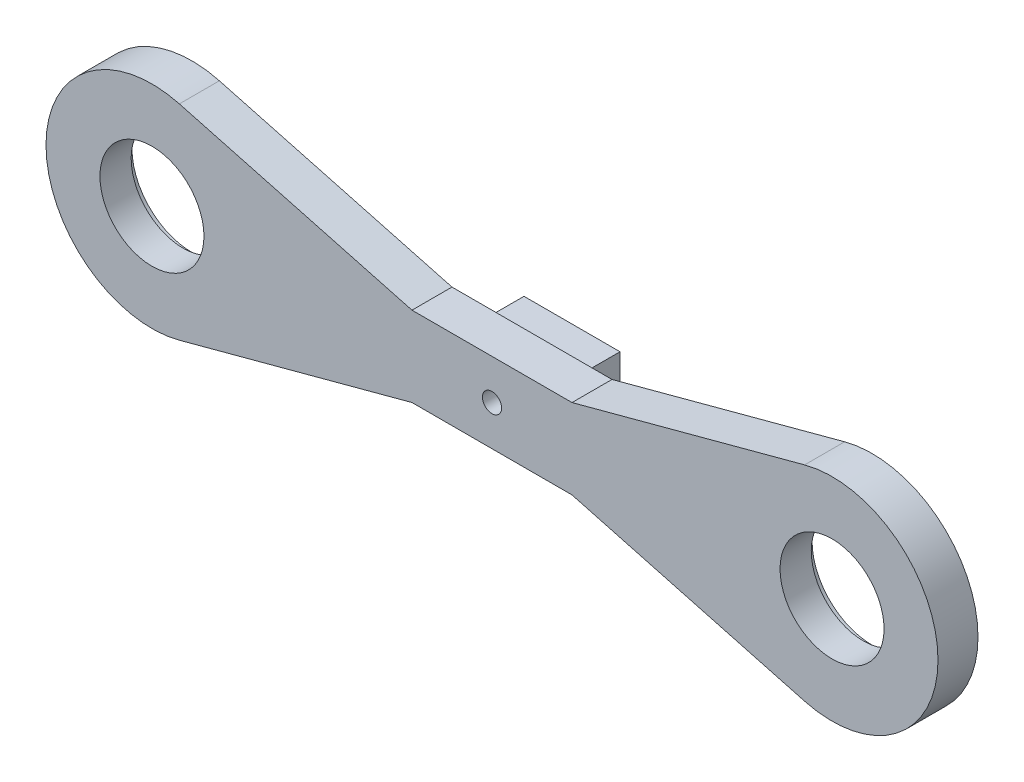
ISO-10303-21;
HEADER;
FILE_DESCRIPTION(('STEP AP214'),'2;1');
FILE_NAME('part.step','',(''),(''),'','','');
FILE_SCHEMA(('AUTOMOTIVE_DESIGN { 1 0 10303 214 1 1 1 1 }'));
ENDSEC;
DATA;
#1=APPLICATION_CONTEXT('core data for automotive mechanical design processes');
#2=APPLICATION_PROTOCOL_DEFINITION('international standard','automotive_design',2000,#1);
#3=PRODUCT_CONTEXT('',#1,'mechanical');
#4=PRODUCT('Part','Part','',(#3));
#5=PRODUCT_RELATED_PRODUCT_CATEGORY('part','',(#4));
#6=PRODUCT_DEFINITION_FORMATION('','',#4);
#7=PRODUCT_DEFINITION_CONTEXT('part definition',#1,'design');
#8=PRODUCT_DEFINITION('design','',#6,#7);
#9=PRODUCT_DEFINITION_SHAPE('','',#8);
#10=(LENGTH_UNIT() NAMED_UNIT(*) SI_UNIT(.MILLI.,.METRE.));
#11=(NAMED_UNIT(*) PLANE_ANGLE_UNIT() SI_UNIT($,.RADIAN.));
#12=(NAMED_UNIT(*) SI_UNIT($,.STERADIAN.) SOLID_ANGLE_UNIT());
#13=UNCERTAINTY_MEASURE_WITH_UNIT(LENGTH_MEASURE(1.E-05),#10,'distance_accuracy_value','');
#14=(GEOMETRIC_REPRESENTATION_CONTEXT(3) GLOBAL_UNCERTAINTY_ASSIGNED_CONTEXT((#13)) GLOBAL_UNIT_ASSIGNED_CONTEXT((#10,
#11,#12)) REPRESENTATION_CONTEXT('',''));
#15=CARTESIAN_POINT('',(0.,0.,0.));
#16=DIRECTION('',(0.,0.,1.));
#17=DIRECTION('',(1.,0.,0.));
#18=AXIS2_PLACEMENT_3D('',#15,#16,#17);
#19=CARTESIAN_POINT('',(-42.5000000000004,0.,5.));
#20=DIRECTION('',(0.,0.,-1.));
#21=DIRECTION('',(-1.,0.,0.));
#22=AXIS2_PLACEMENT_3D('',#19,#20,#21);
#23=CYLINDRICAL_SURFACE('',#22,6.5);
#24=CARTESIAN_POINT('',(-42.5000000000004,0.,5.));
#25=DIRECTION('',(0.,0.,1.));
#26=DIRECTION('',(1.,0.,0.));
#27=AXIS2_PLACEMENT_3D('',#24,#25,#26);
#28=CIRCLE('',#27,6.5);
#29=CARTESIAN_POINT('',(-36.0000000000004,0.,5.));
#30=VERTEX_POINT('',#29);
#31=EDGE_CURVE('E280',#30,#30,#28,.T.);
#32=ORIENTED_EDGE('',*,*,#31,.T.);
#33=EDGE_LOOP('',(#32));
#34=FACE_BOUND('',#33,.T.);
#35=CARTESIAN_POINT('',(-42.5000000000004,0.,1.1));
#36=DIRECTION('',(0.,0.,-1.));
#37=DIRECTION('',(-1.,0.,0.));
#38=AXIS2_PLACEMENT_3D('',#35,#36,#37);
#39=CIRCLE('',#38,6.5);
#40=CARTESIAN_POINT('',(-49.0000000000004,0.,1.1));
#41=VERTEX_POINT('',#40);
#42=EDGE_CURVE('E67',#41,#41,#39,.T.);
#43=ORIENTED_EDGE('',*,*,#42,.T.);
#44=EDGE_LOOP('',(#43));
#45=FACE_BOUND('',#44,.T.);
#46=ADVANCED_FACE('F63',(#34,#45),#23,.F.);
#47=CARTESIAN_POINT('',(42.4999999999997,0.,5.));
#48=DIRECTION('',(0.,0.,-1.));
#49=DIRECTION('',(-1.,0.,0.));
#50=AXIS2_PLACEMENT_3D('',#47,#48,#49);
#51=CYLINDRICAL_SURFACE('',#50,6.5);
#52=CARTESIAN_POINT('',(42.4999999999997,0.,5.));
#53=DIRECTION('',(0.,0.,1.));
#54=DIRECTION('',(1.,0.,0.));
#55=AXIS2_PLACEMENT_3D('',#52,#53,#54);
#56=CIRCLE('',#55,6.5);
#57=CARTESIAN_POINT('',(48.9999999999996,0.,5.));
#58=VERTEX_POINT('',#57);
#59=EDGE_CURVE('E266',#58,#58,#56,.T.);
#60=ORIENTED_EDGE('',*,*,#59,.T.);
#61=EDGE_LOOP('',(#60));
#62=FACE_BOUND('',#61,.T.);
#63=CARTESIAN_POINT('',(42.4999999999997,0.,1.1));
#64=DIRECTION('',(0.,0.,-1.));
#65=DIRECTION('',(-1.,0.,0.));
#66=AXIS2_PLACEMENT_3D('',#63,#64,#65);
#67=CIRCLE('',#66,6.5);
#68=CARTESIAN_POINT('',(35.9999999999997,0.,1.1));
#69=VERTEX_POINT('',#68);
#70=EDGE_CURVE('E360',#69,#69,#67,.T.);
#71=ORIENTED_EDGE('',*,*,#70,.T.);
#72=EDGE_LOOP('',(#71));
#73=FACE_BOUND('',#72,.T.);
#74=ADVANCED_FACE('F416',(#62,#73),#51,.F.);
#75=CARTESIAN_POINT('',(-42.5000000000004,0.,5.));
#76=DIRECTION('',(0.,0.,1.));
#77=DIRECTION('',(1.,0.,0.));
#78=AXIS2_PLACEMENT_3D('',#75,#76,#77);
#79=PLANE('',#78);
#80=CARTESIAN_POINT('',(0.,0.,5.));
#81=DIRECTION('',(0.,0.,-1.));
#82=DIRECTION('',(-1.,0.,0.));
#83=AXIS2_PLACEMENT_3D('',#80,#81,#82);
#84=CIRCLE('',#83,1.2);
#85=CARTESIAN_POINT('',(-1.2,0.,5.));
#86=VERTEX_POINT('',#85);
#87=EDGE_CURVE('E223',#86,#86,#84,.T.);
#88=ORIENTED_EDGE('',*,*,#87,.T.);
#89=EDGE_LOOP('',(#88));
#90=FACE_BOUND('',#89,.T.);
#91=ORIENTED_EDGE('',*,*,#31,.F.);
#92=EDGE_LOOP('',(#91));
#93=FACE_BOUND('',#92,.T.);
#94=DIRECTION('',(-0.96592582628907,0.258819045102515,0.));
#95=VECTOR('',#94,1.);
#96=CARTESIAN_POINT('',(-10.,5.,5.));
#97=LINE('',#96,#95);
#98=CARTESIAN_POINT('',(-10.,5.,5.));
#99=VERTEX_POINT('',#98);
#100=CARTESIAN_POINT('',(-39.0729128114976,12.790063509461,5.));
#101=VERTEX_POINT('',#100);
#102=EDGE_CURVE('E285',#99,#101,#97,.T.);
#103=ORIENTED_EDGE('',*,*,#102,.T.);
#104=CARTESIAN_POINT('',(-42.5000000000004,0.,5.));
#105=DIRECTION('',(0.,0.,1.));
#106=DIRECTION('',(1.,0.,0.));
#107=AXIS2_PLACEMENT_3D('',#104,#105,#106);
#108=CIRCLE('',#107,13.2412480972772);
#109=CARTESIAN_POINT('',(-39.0729128114976,-12.790063509461,5.));
#110=VERTEX_POINT('',#109);
#111=EDGE_CURVE('E289',#101,#110,#108,.T.);
#112=ORIENTED_EDGE('',*,*,#111,.T.);
#113=DIRECTION('',(0.96592582628907,0.258819045102515,0.));
#114=VECTOR('',#113,1.);
#115=CARTESIAN_POINT('',(-10.,-5.,5.));
#116=LINE('',#115,#114);
#117=CARTESIAN_POINT('',(-10.,-5.,5.));
#118=VERTEX_POINT('',#117);
#119=EDGE_CURVE('E293',#110,#118,#116,.T.);
#120=ORIENTED_EDGE('',*,*,#119,.T.);
#121=DIRECTION('',(1.,0.,0.));
#122=VECTOR('',#121,1.);
#123=CARTESIAN_POINT('',(-10.,-5.,5.));
#124=LINE('',#123,#122);
#125=CARTESIAN_POINT('',(10.,-5.,5.));
#126=VERTEX_POINT('',#125);
#127=EDGE_CURVE('E296',#118,#126,#124,.T.);
#128=ORIENTED_EDGE('',*,*,#127,.T.);
#129=DIRECTION('',(0.965925826289068,-0.258819045102521,0.));
#130=VECTOR('',#129,1.);
#131=CARTESIAN_POINT('',(10.,-5.,5.));
#132=LINE('',#131,#130);
#133=CARTESIAN_POINT('',(39.0729128114968,-12.790063509461,5.));
#134=VERTEX_POINT('',#133);
#135=EDGE_CURVE('E299',#126,#134,#132,.T.);
#136=ORIENTED_EDGE('',*,*,#135,.T.);
#137=CARTESIAN_POINT('',(42.4999999999997,0.,5.));
#138=DIRECTION('',(0.,0.,1.));
#139=DIRECTION('',(-1.,0.,0.));
#140=AXIS2_PLACEMENT_3D('',#137,#138,#139);
#141=CIRCLE('',#140,13.2412480972772);
#142=CARTESIAN_POINT('',(39.0729128114968,12.790063509461,5.));
#143=VERTEX_POINT('',#142);
#144=EDGE_CURVE('E302',#134,#143,#141,.T.);
#145=ORIENTED_EDGE('',*,*,#144,.T.);
#146=DIRECTION('',(-0.965925826289068,-0.258819045102521,0.));
#147=VECTOR('',#146,1.);
#148=CARTESIAN_POINT('',(10.,5.,5.));
#149=LINE('',#148,#147);
#150=CARTESIAN_POINT('',(10.,5.,5.));
#151=VERTEX_POINT('',#150);
#152=EDGE_CURVE('E305',#143,#151,#149,.T.);
#153=ORIENTED_EDGE('',*,*,#152,.T.);
#154=DIRECTION('',(-1.,0.,0.));
#155=VECTOR('',#154,1.);
#156=CARTESIAN_POINT('',(-10.,5.,5.));
#157=LINE('',#156,#155);
#158=EDGE_CURVE('E308',#151,#99,#157,.T.);
#159=ORIENTED_EDGE('',*,*,#158,.T.);
#160=EDGE_LOOP('',(#103,#112,#120,#128,#136,#145,#153,#159));
#161=FACE_BOUND('',#160,.T.);
#162=ORIENTED_EDGE('',*,*,#59,.F.);
#163=EDGE_LOOP('',(#162));
#164=FACE_BOUND('',#163,.T.);
#165=ADVANCED_FACE('F422',(#90,#93,#161,#164),#79,.T.);
#166=CARTESIAN_POINT('',(-42.5000000000004,0.,0.));
#167=DIRECTION('',(0.,0.,1.));
#168=DIRECTION('',(1.,0.,0.));
#169=AXIS2_PLACEMENT_3D('',#166,#167,#168);
#170=PLANE('',#169);
#171=CARTESIAN_POINT('',(-42.5000000000004,0.,0.));
#172=DIRECTION('',(0.,0.,-1.));
#173=DIRECTION('',(-1.,0.,0.));
#174=AXIS2_PLACEMENT_3D('',#171,#172,#173);
#175=CIRCLE('',#174,7.5);
#176=CARTESIAN_POINT('',(-50.0000000000004,0.,0.));
#177=VERTEX_POINT('',#176);
#178=EDGE_CURVE('E370',#177,#177,#175,.T.);
#179=ORIENTED_EDGE('',*,*,#178,.F.);
#180=EDGE_LOOP('',(#179));
#181=FACE_BOUND('',#180,.T.);
#182=CARTESIAN_POINT('',(42.4999999999997,0.,0.));
#183=DIRECTION('',(0.,0.,-1.));
#184=DIRECTION('',(-1.,0.,0.));
#185=AXIS2_PLACEMENT_3D('',#182,#183,#184);
#186=CIRCLE('',#185,7.5);
#187=CARTESIAN_POINT('',(34.9999999999997,0.,0.));
#188=VERTEX_POINT('',#187);
#189=EDGE_CURVE('E376',#188,#188,#186,.T.);
#190=ORIENTED_EDGE('',*,*,#189,.F.);
#191=EDGE_LOOP('',(#190));
#192=FACE_BOUND('',#191,.T.);
#193=DIRECTION('',(-1.,0.,0.));
#194=VECTOR('',#193,1.);
#195=CARTESIAN_POINT('',(0.,3.5,0.));
#196=LINE('',#195,#194);
#197=CARTESIAN_POINT('',(6.,3.5,0.));
#198=VERTEX_POINT('',#197);
#199=CARTESIAN_POINT('',(-6.,3.5,0.));
#200=VERTEX_POINT('',#199);
#201=EDGE_CURVE('E81',#198,#200,#196,.T.);
#202=ORIENTED_EDGE('',*,*,#201,.T.);
#203=DIRECTION('',(0.,-1.,0.));
#204=VECTOR('',#203,1.);
#205=CARTESIAN_POINT('',(-6.,0.,0.));
#206=LINE('',#205,#204);
#207=CARTESIAN_POINT('',(-6.,-3.5,0.));
#208=VERTEX_POINT('',#207);
#209=EDGE_CURVE('E232',#200,#208,#206,.T.);
#210=ORIENTED_EDGE('',*,*,#209,.T.);
#211=DIRECTION('',(-1.,0.,0.));
#212=VECTOR('',#211,1.);
#213=CARTESIAN_POINT('',(0.,-3.5,0.));
#214=LINE('',#213,#212);
#215=CARTESIAN_POINT('',(6.,-3.5,0.));
#216=VERTEX_POINT('',#215);
#217=EDGE_CURVE('E255',#216,#208,#214,.T.);
#218=ORIENTED_EDGE('',*,*,#217,.F.);
#219=DIRECTION('',(0.,-1.,0.));
#220=VECTOR('',#219,1.);
#221=CARTESIAN_POINT('',(6.,0.,0.));
#222=LINE('',#221,#220);
#223=EDGE_CURVE('E86',#198,#216,#222,.T.);
#224=ORIENTED_EDGE('',*,*,#223,.F.);
#225=EDGE_LOOP('',(#202,#210,#218,#224));
#226=FACE_BOUND('',#225,.T.);
#227=DIRECTION('',(-0.96592582628907,0.258819045102515,0.));
#228=VECTOR('',#227,1.);
#229=CARTESIAN_POINT('',(-10.,5.,0.));
#230=LINE('',#229,#228);
#231=CARTESIAN_POINT('',(-10.,5.,0.));
#232=VERTEX_POINT('',#231);
#233=CARTESIAN_POINT('',(-39.0729128114976,12.790063509461,0.));
#234=VERTEX_POINT('',#233);
#235=EDGE_CURVE('E284',#232,#234,#230,.T.);
#236=ORIENTED_EDGE('',*,*,#235,.F.);
#237=DIRECTION('',(-1.,0.,0.));
#238=VECTOR('',#237,1.);
#239=CARTESIAN_POINT('',(-10.,5.,0.));
#240=LINE('',#239,#238);
#241=CARTESIAN_POINT('',(10.,5.,0.));
#242=VERTEX_POINT('',#241);
#243=EDGE_CURVE('E290',#242,#232,#240,.T.);
#244=ORIENTED_EDGE('',*,*,#243,.F.);
#245=DIRECTION('',(-0.965925826289068,-0.258819045102521,0.));
#246=VECTOR('',#245,1.);
#247=CARTESIAN_POINT('',(10.,5.,0.));
#248=LINE('',#247,#246);
#249=CARTESIAN_POINT('',(39.0729128114968,12.790063509461,0.));
#250=VERTEX_POINT('',#249);
#251=EDGE_CURVE('E330',#250,#242,#248,.T.);
#252=ORIENTED_EDGE('',*,*,#251,.F.);
#253=CARTESIAN_POINT('',(42.4999999999997,0.,0.));
#254=DIRECTION('',(0.,0.,1.));
#255=DIRECTION('',(-1.,0.,0.));
#256=AXIS2_PLACEMENT_3D('',#253,#254,#255);
#257=CIRCLE('',#256,13.2412480972772);
#258=CARTESIAN_POINT('',(39.0729128114968,-12.790063509461,0.));
#259=VERTEX_POINT('',#258);
#260=EDGE_CURVE('E327',#259,#250,#257,.T.);
#261=ORIENTED_EDGE('',*,*,#260,.F.);
#262=DIRECTION('',(0.965925826289068,-0.258819045102521,0.));
#263=VECTOR('',#262,1.);
#264=CARTESIAN_POINT('',(10.,-5.,0.));
#265=LINE('',#264,#263);
#266=CARTESIAN_POINT('',(10.,-5.,0.));
#267=VERTEX_POINT('',#266);
#268=EDGE_CURVE('E324',#267,#259,#265,.T.);
#269=ORIENTED_EDGE('',*,*,#268,.F.);
#270=DIRECTION('',(1.,0.,0.));
#271=VECTOR('',#270,1.);
#272=CARTESIAN_POINT('',(-10.,-5.,0.));
#273=LINE('',#272,#271);
#274=CARTESIAN_POINT('',(-10.,-5.,0.));
#275=VERTEX_POINT('',#274);
#276=EDGE_CURVE('E321',#275,#267,#273,.T.);
#277=ORIENTED_EDGE('',*,*,#276,.F.);
#278=DIRECTION('',(0.96592582628907,0.258819045102515,0.));
#279=VECTOR('',#278,1.);
#280=CARTESIAN_POINT('',(-10.,-5.,0.));
#281=LINE('',#280,#279);
#282=CARTESIAN_POINT('',(-39.0729128114976,-12.790063509461,0.));
#283=VERTEX_POINT('',#282);
#284=EDGE_CURVE('E318',#283,#275,#281,.T.);
#285=ORIENTED_EDGE('',*,*,#284,.F.);
#286=CARTESIAN_POINT('',(-42.5000000000004,0.,0.));
#287=DIRECTION('',(0.,0.,1.));
#288=DIRECTION('',(1.,0.,0.));
#289=AXIS2_PLACEMENT_3D('',#286,#287,#288);
#290=CIRCLE('',#289,13.2412480972772);
#291=EDGE_CURVE('E315',#234,#283,#290,.T.);
#292=ORIENTED_EDGE('',*,*,#291,.F.);
#293=EDGE_LOOP('',(#236,#244,#252,#261,#269,#277,#285,#292));
#294=FACE_BOUND('',#293,.T.);
#295=ADVANCED_FACE('F399',(#181,#192,#226,#294),#170,.F.);
#296=CARTESIAN_POINT('',(-10.,5.,5.));
#297=DIRECTION('',(-0.258819045102515,-0.96592582628907,0.));
#298=DIRECTION('',(0.96592582628907,-0.258819045102515,0.));
#299=AXIS2_PLACEMENT_3D('',#296,#297,#298);
#300=PLANE('',#299);
#301=ORIENTED_EDGE('',*,*,#235,.T.);
#302=DIRECTION('',(0.,0.,-1.));
#303=VECTOR('',#302,1.);
#304=CARTESIAN_POINT('',(-39.0729128114976,12.790063509461,5.));
#305=LINE('',#304,#303);
#306=EDGE_CURVE('E12',#101,#234,#305,.T.);
#307=ORIENTED_EDGE('',*,*,#306,.F.);
#308=ORIENTED_EDGE('',*,*,#102,.F.);
#309=DIRECTION('',(0.,0.,-1.));
#310=VECTOR('',#309,1.);
#311=CARTESIAN_POINT('',(-10.,5.,5.));
#312=LINE('',#311,#310);
#313=EDGE_CURVE('E311',#99,#232,#312,.T.);
#314=ORIENTED_EDGE('',*,*,#313,.T.);
#315=EDGE_LOOP('',(#301,#307,#308,#314));
#316=FACE_BOUND('',#315,.T.);
#317=ADVANCED_FACE('F65',(#316),#300,.F.);
#318=CARTESIAN_POINT('',(-42.5000000000004,0.,5.));
#319=DIRECTION('',(0.,0.,-1.));
#320=DIRECTION('',(-1.,0.,0.));
#321=AXIS2_PLACEMENT_3D('',#318,#319,#320);
#322=CYLINDRICAL_SURFACE('',#321,13.2412480972772);
#323=ORIENTED_EDGE('',*,*,#291,.T.);
#324=DIRECTION('',(0.,0.,-1.));
#325=VECTOR('',#324,1.);
#326=CARTESIAN_POINT('',(-39.0729128114976,-12.790063509461,5.));
#327=LINE('',#326,#325);
#328=EDGE_CURVE('E73',#110,#283,#327,.T.);
#329=ORIENTED_EDGE('',*,*,#328,.F.);
#330=ORIENTED_EDGE('',*,*,#111,.F.);
#331=ORIENTED_EDGE('',*,*,#306,.T.);
#332=EDGE_LOOP('',(#323,#329,#330,#331));
#333=FACE_BOUND('',#332,.T.);
#334=ADVANCED_FACE('F455',(#333),#322,.T.);
#335=CARTESIAN_POINT('',(-10.,-5.,5.));
#336=DIRECTION('',(-0.258819045102515,0.96592582628907,0.));
#337=DIRECTION('',(-0.96592582628907,-0.258819045102515,0.));
#338=AXIS2_PLACEMENT_3D('',#335,#336,#337);
#339=PLANE('',#338);
#340=ORIENTED_EDGE('',*,*,#284,.T.);
#341=DIRECTION('',(0.,0.,-1.));
#342=VECTOR('',#341,1.);
#343=CARTESIAN_POINT('',(-10.,-5.,5.));
#344=LINE('',#343,#342);
#345=EDGE_CURVE('E354',#118,#275,#344,.T.);
#346=ORIENTED_EDGE('',*,*,#345,.F.);
#347=ORIENTED_EDGE('',*,*,#119,.F.);
#348=ORIENTED_EDGE('',*,*,#328,.T.);
#349=EDGE_LOOP('',(#340,#346,#347,#348));
#350=FACE_BOUND('',#349,.T.);
#351=ADVANCED_FACE('F452',(#350),#339,.F.);
#352=CARTESIAN_POINT('',(-10.,-5.,5.));
#353=DIRECTION('',(0.,1.,0.));
#354=DIRECTION('',(0.,0.,1.));
#355=AXIS2_PLACEMENT_3D('',#352,#353,#354);
#356=PLANE('',#355);
#357=ORIENTED_EDGE('',*,*,#276,.T.);
#358=DIRECTION('',(0.,0.,-1.));
#359=VECTOR('',#358,1.);
#360=CARTESIAN_POINT('',(10.,-5.,5.));
#361=LINE('',#360,#359);
#362=EDGE_CURVE('E350',#126,#267,#361,.T.);
#363=ORIENTED_EDGE('',*,*,#362,.F.);
#364=ORIENTED_EDGE('',*,*,#127,.F.);
#365=ORIENTED_EDGE('',*,*,#345,.T.);
#366=EDGE_LOOP('',(#357,#363,#364,#365));
#367=FACE_BOUND('',#366,.T.);
#368=ADVANCED_FACE('F448',(#367),#356,.F.);
#369=CARTESIAN_POINT('',(10.,-5.,5.));
#370=DIRECTION('',(0.258819045102521,0.965925826289068,0.));
#371=DIRECTION('',(-0.965925826289068,0.258819045102521,0.));
#372=AXIS2_PLACEMENT_3D('',#369,#370,#371);
#373=PLANE('',#372);
#374=ORIENTED_EDGE('',*,*,#268,.T.);
#375=DIRECTION('',(0.,0.,-1.));
#376=VECTOR('',#375,1.);
#377=CARTESIAN_POINT('',(39.0729128114968,-12.790063509461,5.));
#378=LINE('',#377,#376);
#379=EDGE_CURVE('E346',#134,#259,#378,.T.);
#380=ORIENTED_EDGE('',*,*,#379,.F.);
#381=ORIENTED_EDGE('',*,*,#135,.F.);
#382=ORIENTED_EDGE('',*,*,#362,.T.);
#383=EDGE_LOOP('',(#374,#380,#381,#382));
#384=FACE_BOUND('',#383,.T.);
#385=ADVANCED_FACE('F444',(#384),#373,.F.);
#386=CARTESIAN_POINT('',(42.4999999999997,0.,5.));
#387=DIRECTION('',(0.,0.,-1.));
#388=DIRECTION('',(-1.,0.,0.));
#389=AXIS2_PLACEMENT_3D('',#386,#387,#388);
#390=CYLINDRICAL_SURFACE('',#389,13.2412480972772);
#391=ORIENTED_EDGE('',*,*,#260,.T.);
#392=DIRECTION('',(0.,0.,-1.));
#393=VECTOR('',#392,1.);
#394=CARTESIAN_POINT('',(39.0729128114968,12.790063509461,5.));
#395=LINE('',#394,#393);
#396=EDGE_CURVE('E342',#143,#250,#395,.T.);
#397=ORIENTED_EDGE('',*,*,#396,.F.);
#398=ORIENTED_EDGE('',*,*,#144,.F.);
#399=ORIENTED_EDGE('',*,*,#379,.T.);
#400=EDGE_LOOP('',(#391,#397,#398,#399));
#401=FACE_BOUND('',#400,.T.);
#402=ADVANCED_FACE('F440',(#401),#390,.T.);
#403=CARTESIAN_POINT('',(10.,5.,5.));
#404=DIRECTION('',(0.258819045102521,-0.965925826289068,0.));
#405=DIRECTION('',(0.965925826289068,0.258819045102521,0.));
#406=AXIS2_PLACEMENT_3D('',#403,#404,#405);
#407=PLANE('',#406);
#408=ORIENTED_EDGE('',*,*,#251,.T.);
#409=DIRECTION('',(0.,0.,-1.));
#410=VECTOR('',#409,1.);
#411=CARTESIAN_POINT('',(10.,5.,5.));
#412=LINE('',#411,#410);
#413=EDGE_CURVE('E338',#151,#242,#412,.T.);
#414=ORIENTED_EDGE('',*,*,#413,.F.);
#415=ORIENTED_EDGE('',*,*,#152,.F.);
#416=ORIENTED_EDGE('',*,*,#396,.T.);
#417=EDGE_LOOP('',(#408,#414,#415,#416));
#418=FACE_BOUND('',#417,.T.);
#419=ADVANCED_FACE('F436',(#418),#407,.F.);
#420=CARTESIAN_POINT('',(-10.,5.,5.));
#421=DIRECTION('',(0.,-1.,0.));
#422=DIRECTION('',(0.,0.,-1.));
#423=AXIS2_PLACEMENT_3D('',#420,#421,#422);
#424=PLANE('',#423);
#425=ORIENTED_EDGE('',*,*,#243,.T.);
#426=ORIENTED_EDGE('',*,*,#313,.F.);
#427=ORIENTED_EDGE('',*,*,#158,.F.);
#428=ORIENTED_EDGE('',*,*,#413,.T.);
#429=EDGE_LOOP('',(#425,#426,#427,#428));
#430=FACE_BOUND('',#429,.T.);
#431=ADVANCED_FACE('F432',(#430),#424,.F.);
#432=CARTESIAN_POINT('',(-6.,0.,-5.));
#433=DIRECTION('',(-1.,0.,0.));
#434=DIRECTION('',(0.,-1.,0.));
#435=AXIS2_PLACEMENT_3D('',#432,#433,#434);
#436=PLANE('',#435);
#437=ORIENTED_EDGE('',*,*,#209,.F.);
#438=DIRECTION('',(0.,0.,1.));
#439=VECTOR('',#438,1.);
#440=CARTESIAN_POINT('',(-6.,3.5,-5.));
#441=LINE('',#440,#439);
#442=CARTESIAN_POINT('',(-6.,3.5,-5.));
#443=VERTEX_POINT('',#442);
#444=EDGE_CURVE('E263',#443,#200,#441,.T.);
#445=ORIENTED_EDGE('',*,*,#444,.F.);
#446=DIRECTION('',(0.,-1.,0.));
#447=VECTOR('',#446,1.);
#448=CARTESIAN_POINT('',(-6.,0.,-5.));
#449=LINE('',#448,#447);
#450=CARTESIAN_POINT('',(-6.,-3.5,-5.));
#451=VERTEX_POINT('',#450);
#452=EDGE_CURVE('E238',#443,#451,#449,.T.);
#453=ORIENTED_EDGE('',*,*,#452,.T.);
#454=DIRECTION('',(0.,0.,1.));
#455=VECTOR('',#454,1.);
#456=CARTESIAN_POINT('',(-6.,-3.5,-5.));
#457=LINE('',#456,#455);
#458=EDGE_CURVE('E252',#451,#208,#457,.T.);
#459=ORIENTED_EDGE('',*,*,#458,.T.);
#460=EDGE_LOOP('',(#437,#445,#453,#459));
#461=FACE_BOUND('',#460,.T.);
#462=ADVANCED_FACE('F435',(#461),#436,.T.);
#463=CARTESIAN_POINT('',(0.,3.5,-5.));
#464=DIRECTION('',(0.,1.,0.));
#465=DIRECTION('',(0.,0.,1.));
#466=AXIS2_PLACEMENT_3D('',#463,#464,#465);
#467=PLANE('',#466);
#468=ORIENTED_EDGE('',*,*,#201,.F.);
#469=DIRECTION('',(0.,0.,1.));
#470=VECTOR('',#469,1.);
#471=CARTESIAN_POINT('',(6.,3.5,-5.));
#472=LINE('',#471,#470);
#473=CARTESIAN_POINT('',(6.,3.5,-5.));
#474=VERTEX_POINT('',#473);
#475=EDGE_CURVE('E267',#474,#198,#472,.T.);
#476=ORIENTED_EDGE('',*,*,#475,.F.);
#477=DIRECTION('',(-1.,0.,0.));
#478=VECTOR('',#477,1.);
#479=CARTESIAN_POINT('',(0.,3.5,-5.));
#480=LINE('',#479,#478);
#481=EDGE_CURVE('E248',#474,#443,#480,.T.);
#482=ORIENTED_EDGE('',*,*,#481,.T.);
#483=ORIENTED_EDGE('',*,*,#444,.T.);
#484=EDGE_LOOP('',(#468,#476,#482,#483));
#485=FACE_BOUND('',#484,.T.);
#486=ADVANCED_FACE('F577',(#485),#467,.T.);
#487=CARTESIAN_POINT('',(6.,0.,-5.));
#488=DIRECTION('',(-1.,0.,0.));
#489=DIRECTION('',(0.,-1.,0.));
#490=AXIS2_PLACEMENT_3D('',#487,#488,#489);
#491=PLANE('',#490);
#492=ORIENTED_EDGE('',*,*,#223,.T.);
#493=DIRECTION('',(0.,0.,1.));
#494=VECTOR('',#493,1.);
#495=CARTESIAN_POINT('',(6.,-3.5,-5.));
#496=LINE('',#495,#494);
#497=CARTESIAN_POINT('',(6.,-3.5,-5.));
#498=VERTEX_POINT('',#497);
#499=EDGE_CURVE('E270',#498,#216,#496,.T.);
#500=ORIENTED_EDGE('',*,*,#499,.F.);
#501=DIRECTION('',(0.,-1.,0.));
#502=VECTOR('',#501,1.);
#503=CARTESIAN_POINT('',(6.,0.,-5.));
#504=LINE('',#503,#502);
#505=EDGE_CURVE('E245',#474,#498,#504,.T.);
#506=ORIENTED_EDGE('',*,*,#505,.F.);
#507=ORIENTED_EDGE('',*,*,#475,.T.);
#508=EDGE_LOOP('',(#492,#500,#506,#507));
#509=FACE_BOUND('',#508,.T.);
#510=ADVANCED_FACE('F567',(#509),#491,.F.);
#511=CARTESIAN_POINT('',(0.,-3.5,-5.));
#512=DIRECTION('',(0.,1.,0.));
#513=DIRECTION('',(-1.,0.,0.));
#514=AXIS2_PLACEMENT_3D('',#511,#512,#513);
#515=PLANE('',#514);
#516=ORIENTED_EDGE('',*,*,#217,.T.);
#517=ORIENTED_EDGE('',*,*,#458,.F.);
#518=DIRECTION('',(-1.,0.,0.));
#519=VECTOR('',#518,1.);
#520=CARTESIAN_POINT('',(0.,-3.5,-5.));
#521=LINE('',#520,#519);
#522=EDGE_CURVE('E242',#498,#451,#521,.T.);
#523=ORIENTED_EDGE('',*,*,#522,.F.);
#524=ORIENTED_EDGE('',*,*,#499,.T.);
#525=EDGE_LOOP('',(#516,#517,#523,#524));
#526=FACE_BOUND('',#525,.T.);
#527=ADVANCED_FACE('F558',(#526),#515,.F.);
#528=CARTESIAN_POINT('',(0.,0.,-5.));
#529=DIRECTION('',(0.,0.,-1.));
#530=DIRECTION('',(-1.,0.,0.));
#531=AXIS2_PLACEMENT_3D('',#528,#529,#530);
#532=PLANE('',#531);
#533=DIRECTION('',(0.,-1.,0.));
#534=VECTOR('',#533,1.);
#535=CARTESIAN_POINT('',(-5.,0.,-5.));
#536=LINE('',#535,#534);
#537=CARTESIAN_POINT('',(-5.,2.5,-5.));
#538=VERTEX_POINT('',#537);
#539=CARTESIAN_POINT('',(-5.,-2.5,-5.));
#540=VERTEX_POINT('',#539);
#541=EDGE_CURVE('E190',#538,#540,#536,.T.);
#542=ORIENTED_EDGE('',*,*,#541,.T.);
#543=DIRECTION('',(-1.,0.,0.));
#544=VECTOR('',#543,1.);
#545=CARTESIAN_POINT('',(0.,-2.5,-5.));
#546=LINE('',#545,#544);
#547=CARTESIAN_POINT('',(5.,-2.5,-5.));
#548=VERTEX_POINT('',#547);
#549=EDGE_CURVE('E177',#548,#540,#546,.T.);
#550=ORIENTED_EDGE('',*,*,#549,.F.);
#551=DIRECTION('',(0.,-1.,0.));
#552=VECTOR('',#551,1.);
#553=CARTESIAN_POINT('',(5.,0.,-5.));
#554=LINE('',#553,#552);
#555=CARTESIAN_POINT('',(5.,2.5,-5.));
#556=VERTEX_POINT('',#555);
#557=EDGE_CURVE('E189',#556,#548,#554,.T.);
#558=ORIENTED_EDGE('',*,*,#557,.F.);
#559=DIRECTION('',(-1.,0.,0.));
#560=VECTOR('',#559,1.);
#561=CARTESIAN_POINT('',(0.,2.5,-5.));
#562=LINE('',#561,#560);
#563=EDGE_CURVE('E200',#556,#538,#562,.T.);
#564=ORIENTED_EDGE('',*,*,#563,.T.);
#565=EDGE_LOOP('',(#542,#550,#558,#564));
#566=FACE_BOUND('',#565,.T.);
#567=ORIENTED_EDGE('',*,*,#452,.F.);
#568=ORIENTED_EDGE('',*,*,#481,.F.);
#569=ORIENTED_EDGE('',*,*,#505,.T.);
#570=ORIENTED_EDGE('',*,*,#522,.T.);
#571=EDGE_LOOP('',(#567,#568,#569,#570));
#572=FACE_BOUND('',#571,.T.);
#573=ADVANCED_FACE('F202',(#566,#572),#532,.T.);
#574=CARTESIAN_POINT('',(-5.,0.,-5.));
#575=DIRECTION('',(-1.,0.,0.));
#576=DIRECTION('',(0.,-1.,0.));
#577=AXIS2_PLACEMENT_3D('',#574,#575,#576);
#578=PLANE('',#577);
#579=DIRECTION('',(0.,-1.,0.));
#580=VECTOR('',#579,1.);
#581=CARTESIAN_POINT('',(-5.,0.,0.));
#582=LINE('',#581,#580);
#583=CARTESIAN_POINT('',(-5.,2.5,0.));
#584=VERTEX_POINT('',#583);
#585=CARTESIAN_POINT('',(-5.,-2.5,0.));
#586=VERTEX_POINT('',#585);
#587=EDGE_CURVE('E197',#584,#586,#582,.T.);
#588=ORIENTED_EDGE('',*,*,#587,.T.);
#589=DIRECTION('',(0.,0.,1.));
#590=VECTOR('',#589,1.);
#591=CARTESIAN_POINT('',(-5.,-2.5,-5.));
#592=LINE('',#591,#590);
#593=EDGE_CURVE('E181',#540,#586,#592,.T.);
#594=ORIENTED_EDGE('',*,*,#593,.F.);
#595=ORIENTED_EDGE('',*,*,#541,.F.);
#596=DIRECTION('',(0.,0.,1.));
#597=VECTOR('',#596,1.);
#598=CARTESIAN_POINT('',(-5.,2.5,-5.));
#599=LINE('',#598,#597);
#600=EDGE_CURVE('E229',#538,#584,#599,.T.);
#601=ORIENTED_EDGE('',*,*,#600,.T.);
#602=EDGE_LOOP('',(#588,#594,#595,#601));
#603=FACE_BOUND('',#602,.T.);
#604=ADVANCED_FACE('F194',(#603),#578,.F.);
#605=CARTESIAN_POINT('',(0.,2.5,-5.));
#606=DIRECTION('',(0.,1.,0.));
#607=DIRECTION('',(0.,0.,1.));
#608=AXIS2_PLACEMENT_3D('',#605,#606,#607);
#609=PLANE('',#608);
#610=DIRECTION('',(-1.,0.,0.));
#611=VECTOR('',#610,1.);
#612=CARTESIAN_POINT('',(0.,2.5,0.));
#613=LINE('',#612,#611);
#614=CARTESIAN_POINT('',(5.,2.5,0.));
#615=VERTEX_POINT('',#614);
#616=EDGE_CURVE('E206',#615,#584,#613,.T.);
#617=ORIENTED_EDGE('',*,*,#616,.T.);
#618=ORIENTED_EDGE('',*,*,#600,.F.);
#619=ORIENTED_EDGE('',*,*,#563,.F.);
#620=DIRECTION('',(0.,0.,1.));
#621=VECTOR('',#620,1.);
#622=CARTESIAN_POINT('',(5.,2.5,-5.));
#623=LINE('',#622,#621);
#624=EDGE_CURVE('E233',#556,#615,#623,.T.);
#625=ORIENTED_EDGE('',*,*,#624,.T.);
#626=EDGE_LOOP('',(#617,#618,#619,#625));
#627=FACE_BOUND('',#626,.T.);
#628=ADVANCED_FACE('F405',(#627),#609,.F.);
#629=CARTESIAN_POINT('',(5.,0.,-5.));
#630=DIRECTION('',(-1.,0.,0.));
#631=DIRECTION('',(0.,-1.,0.));
#632=AXIS2_PLACEMENT_3D('',#629,#630,#631);
#633=PLANE('',#632);
#634=DIRECTION('',(0.,-1.,0.));
#635=VECTOR('',#634,1.);
#636=CARTESIAN_POINT('',(5.,0.,0.));
#637=LINE('',#636,#635);
#638=CARTESIAN_POINT('',(5.,-2.5,0.));
#639=VERTEX_POINT('',#638);
#640=EDGE_CURVE('E210',#615,#639,#637,.T.);
#641=ORIENTED_EDGE('',*,*,#640,.F.);
#642=ORIENTED_EDGE('',*,*,#624,.F.);
#643=ORIENTED_EDGE('',*,*,#557,.T.);
#644=DIRECTION('',(0.,0.,1.));
#645=VECTOR('',#644,1.);
#646=CARTESIAN_POINT('',(5.,-2.5,-5.));
#647=LINE('',#646,#645);
#648=EDGE_CURVE('E183',#548,#639,#647,.T.);
#649=ORIENTED_EDGE('',*,*,#648,.T.);
#650=EDGE_LOOP('',(#641,#642,#643,#649));
#651=FACE_BOUND('',#650,.T.);
#652=ADVANCED_FACE('F403',(#651),#633,.T.);
#653=CARTESIAN_POINT('',(0.,-2.5,-5.));
#654=DIRECTION('',(0.,1.,0.));
#655=DIRECTION('',(-1.,0.,0.));
#656=AXIS2_PLACEMENT_3D('',#653,#654,#655);
#657=PLANE('',#656);
#658=DIRECTION('',(-1.,0.,0.));
#659=VECTOR('',#658,1.);
#660=CARTESIAN_POINT('',(0.,-2.5,0.));
#661=LINE('',#660,#659);
#662=EDGE_CURVE('E222',#639,#586,#661,.T.);
#663=ORIENTED_EDGE('',*,*,#662,.F.);
#664=ORIENTED_EDGE('',*,*,#648,.F.);
#665=ORIENTED_EDGE('',*,*,#549,.T.);
#666=ORIENTED_EDGE('',*,*,#593,.T.);
#667=EDGE_LOOP('',(#663,#664,#665,#666));
#668=FACE_BOUND('',#667,.T.);
#669=ADVANCED_FACE('F180',(#668),#657,.T.);
#670=CARTESIAN_POINT('',(0.,0.,0.));
#671=DIRECTION('',(0.,0.,-1.));
#672=DIRECTION('',(-1.,0.,0.));
#673=AXIS2_PLACEMENT_3D('',#670,#671,#672);
#674=CIRCLE('',#673,1.2);
#675=CARTESIAN_POINT('',(-1.2,0.,0.));
#676=VERTEX_POINT('',#675);
#677=EDGE_CURVE('E213',#676,#676,#674,.T.);
#678=ORIENTED_EDGE('',*,*,#677,.F.);
#679=EDGE_LOOP('',(#678));
#680=FACE_BOUND('',#679,.T.);
#681=ORIENTED_EDGE('',*,*,#587,.F.);
#682=ORIENTED_EDGE('',*,*,#616,.F.);
#683=ORIENTED_EDGE('',*,*,#640,.T.);
#684=ORIENTED_EDGE('',*,*,#662,.T.);
#685=EDGE_LOOP('',(#681,#682,#683,#684));
#686=FACE_BOUND('',#685,.T.);
#687=ADVANCED_FACE('F395',(#680,#686),#170,.F.);
#688=CARTESIAN_POINT('',(0.,0.,5.));
#689=DIRECTION('',(0.,0.,-1.));
#690=DIRECTION('',(-1.,0.,0.));
#691=AXIS2_PLACEMENT_3D('',#688,#689,#690);
#692=CYLINDRICAL_SURFACE('',#691,1.2);
#693=ORIENTED_EDGE('',*,*,#87,.F.);
#694=EDGE_LOOP('',(#693));
#695=FACE_BOUND('',#694,.T.);
#696=ORIENTED_EDGE('',*,*,#677,.T.);
#697=EDGE_LOOP('',(#696));
#698=FACE_BOUND('',#697,.T.);
#699=ADVANCED_FACE('F393',(#695,#698),#692,.F.);
#700=CARTESIAN_POINT('',(42.4999999999997,0.,1.1));
#701=DIRECTION('',(0.,0.,-1.));
#702=DIRECTION('',(-1.,0.,0.));
#703=AXIS2_PLACEMENT_3D('',#700,#701,#702);
#704=CYLINDRICAL_SURFACE('',#703,7.5);
#705=CARTESIAN_POINT('',(42.4999999999997,0.,1.1));
#706=DIRECTION('',(0.,0.,-1.));
#707=DIRECTION('',(-1.,0.,0.));
#708=AXIS2_PLACEMENT_3D('',#705,#706,#707);
#709=CIRCLE('',#708,7.5);
#710=CARTESIAN_POINT('',(34.9999999999997,0.,1.1));
#711=VERTEX_POINT('',#710);
#712=EDGE_CURVE('E382',#711,#711,#709,.T.);
#713=ORIENTED_EDGE('',*,*,#712,.F.);
#714=EDGE_LOOP('',(#713));
#715=FACE_BOUND('',#714,.T.);
#716=ORIENTED_EDGE('',*,*,#189,.T.);
#717=EDGE_LOOP('',(#716));
#718=FACE_BOUND('',#717,.T.);
#719=ADVANCED_FACE('F519',(#715,#718),#704,.F.);
#720=CARTESIAN_POINT('',(42.4999999999997,0.,1.1));
#721=DIRECTION('',(0.,0.,-1.));
#722=DIRECTION('',(-1.,0.,0.));
#723=AXIS2_PLACEMENT_3D('',#720,#721,#722);
#724=PLANE('',#723);
#725=ORIENTED_EDGE('',*,*,#70,.F.);
#726=EDGE_LOOP('',(#725));
#727=FACE_BOUND('',#726,.T.);
#728=ORIENTED_EDGE('',*,*,#712,.T.);
#729=EDGE_LOOP('',(#728));
#730=FACE_BOUND('',#729,.T.);
#731=ADVANCED_FACE('F654',(#727,#730),#724,.T.);
#732=CARTESIAN_POINT('',(-42.5000000000004,0.,1.1));
#733=DIRECTION('',(0.,0.,-1.));
#734=DIRECTION('',(-1.,0.,0.));
#735=AXIS2_PLACEMENT_3D('',#732,#733,#734);
#736=CYLINDRICAL_SURFACE('',#735,7.5);
#737=CARTESIAN_POINT('',(-42.5000000000004,0.,1.1));
#738=DIRECTION('',(0.,0.,-1.));
#739=DIRECTION('',(-1.,0.,0.));
#740=AXIS2_PLACEMENT_3D('',#737,#738,#739);
#741=CIRCLE('',#740,7.5);
#742=CARTESIAN_POINT('',(-50.0000000000004,0.,1.1));
#743=VERTEX_POINT('',#742);
#744=EDGE_CURVE('E363',#743,#743,#741,.T.);
#745=ORIENTED_EDGE('',*,*,#744,.F.);
#746=EDGE_LOOP('',(#745));
#747=FACE_BOUND('',#746,.T.);
#748=ORIENTED_EDGE('',*,*,#178,.T.);
#749=EDGE_LOOP('',(#748));
#750=FACE_BOUND('',#749,.T.);
#751=ADVANCED_FACE('F661',(#747,#750),#736,.F.);
#752=CARTESIAN_POINT('',(-42.5000000000004,0.,1.1));
#753=DIRECTION('',(0.,0.,-1.));
#754=DIRECTION('',(-1.,0.,0.));
#755=AXIS2_PLACEMENT_3D('',#752,#753,#754);
#756=PLANE('',#755);
#757=ORIENTED_EDGE('',*,*,#42,.F.);
#758=EDGE_LOOP('',(#757));
#759=FACE_BOUND('',#758,.T.);
#760=ORIENTED_EDGE('',*,*,#744,.T.);
#761=EDGE_LOOP('',(#760));
#762=FACE_BOUND('',#761,.T.);
#763=ADVANCED_FACE('F669',(#759,#762),#756,.T.);
#764=CLOSED_SHELL('',(#46,#74,#165,#295,#317,#334,#351,#368,#385,#402,#419,#431,#462,#486,#510,
#527,#573,#604,#628,#652,#669,#687,#699,#719,#731,#751,#763));
#765=MANIFOLD_SOLID_BREP('B2',#764);
#766=ADVANCED_BREP_SHAPE_REPRESENTATION('',(#18,#765),#14);
#767=SHAPE_DEFINITION_REPRESENTATION(#9,#766);
ENDSEC;
END-ISO-10303-21;
